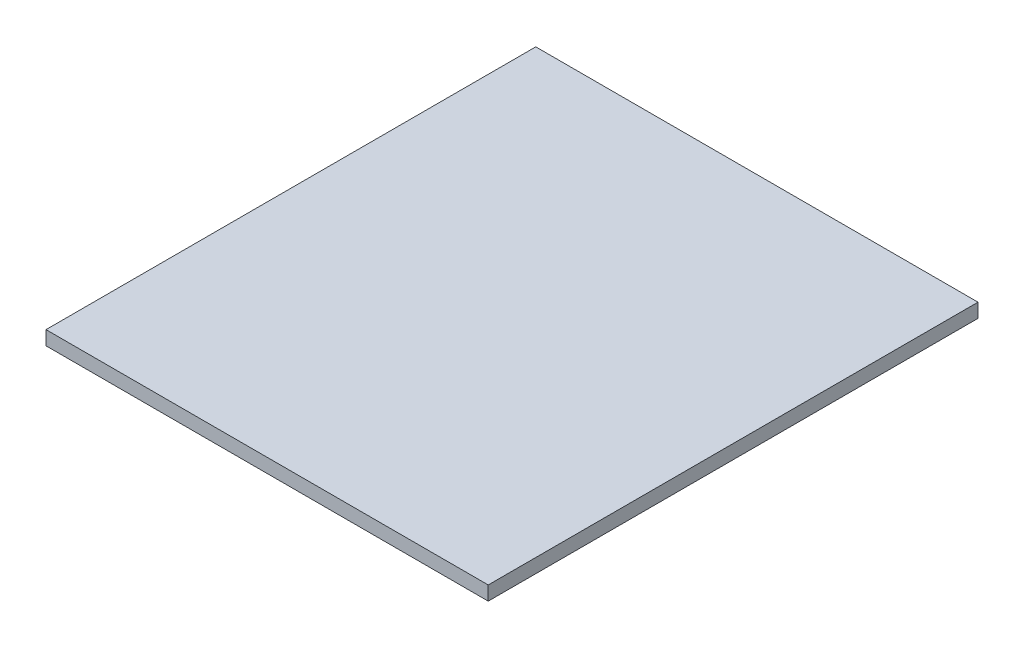
ISO-10303-21;
HEADER;
FILE_DESCRIPTION(('STEP AP214'),'2;1');
FILE_NAME('part.step','',(''),(''),'','','');
FILE_SCHEMA(('AUTOMOTIVE_DESIGN { 1 0 10303 214 1 1 1 1 }'));
ENDSEC;
DATA;
#1=APPLICATION_CONTEXT('core data for automotive mechanical design processes');
#2=APPLICATION_PROTOCOL_DEFINITION('international standard','automotive_design',2000,#1);
#3=PRODUCT_CONTEXT('',#1,'mechanical');
#4=PRODUCT('Part','Part','',(#3));
#5=PRODUCT_RELATED_PRODUCT_CATEGORY('part','',(#4));
#6=PRODUCT_DEFINITION_FORMATION('','',#4);
#7=PRODUCT_DEFINITION_CONTEXT('part definition',#1,'design');
#8=PRODUCT_DEFINITION('design','',#6,#7);
#9=PRODUCT_DEFINITION_SHAPE('','',#8);
#10=(LENGTH_UNIT() NAMED_UNIT(*) SI_UNIT(.MILLI.,.METRE.));
#11=(NAMED_UNIT(*) PLANE_ANGLE_UNIT() SI_UNIT($,.RADIAN.));
#12=(NAMED_UNIT(*) SI_UNIT($,.STERADIAN.) SOLID_ANGLE_UNIT());
#13=UNCERTAINTY_MEASURE_WITH_UNIT(LENGTH_MEASURE(1.E-05),#10,'distance_accuracy_value','');
#14=(GEOMETRIC_REPRESENTATION_CONTEXT(3) GLOBAL_UNCERTAINTY_ASSIGNED_CONTEXT((#13)) GLOBAL_UNIT_ASSIGNED_CONTEXT((#10,
#11,#12)) REPRESENTATION_CONTEXT('',''));
#15=CARTESIAN_POINT('',(0.,0.,0.));
#16=DIRECTION('',(0.,0.,1.));
#17=DIRECTION('',(1.,0.,0.));
#18=AXIS2_PLACEMENT_3D('',#15,#16,#17);
#19=CARTESIAN_POINT('',(40.,13.93,-10.16));
#20=DIRECTION('',(0.,-1.,0.));
#21=DIRECTION('',(0.,0.,-1.));
#22=AXIS2_PLACEMENT_3D('',#19,#20,#21);
#23=PLANE('',#22);
#24=DIRECTION('',(-1.,0.,0.));
#25=VECTOR('',#24,1.);
#26=CARTESIAN_POINT('',(0.,13.93,0.));
#27=LINE('',#26,#25);
#28=CARTESIAN_POINT('',(40.,13.93,0.));
#29=VERTEX_POINT('',#28);
#30=CARTESIAN_POINT('',(0.,13.93,0.));
#31=VERTEX_POINT('',#30);
#32=EDGE_CURVE('E96',#29,#31,#27,.T.);
#33=ORIENTED_EDGE('',*,*,#32,.T.);
#34=DIRECTION('',(0.,0.,-1.));
#35=VECTOR('',#34,1.);
#36=CARTESIAN_POINT('',(0.,13.93,-10.16));
#37=LINE('',#36,#35);
#38=CARTESIAN_POINT('',(0.,13.93,-44.3));
#39=VERTEX_POINT('',#38);
#40=EDGE_CURVE('E11',#31,#39,#37,.T.);
#41=ORIENTED_EDGE('',*,*,#40,.T.);
#42=DIRECTION('',(1.,0.,0.));
#43=VECTOR('',#42,1.);
#44=CARTESIAN_POINT('',(0.,13.93,-44.3));
#45=LINE('',#44,#43);
#46=CARTESIAN_POINT('',(40.,13.93,-44.3));
#47=VERTEX_POINT('',#46);
#48=EDGE_CURVE('E93',#39,#47,#45,.T.);
#49=ORIENTED_EDGE('',*,*,#48,.T.);
#50=DIRECTION('',(0.,0.,1.));
#51=VECTOR('',#50,1.);
#52=CARTESIAN_POINT('',(40.,13.93,-10.16));
#53=LINE('',#52,#51);
#54=EDGE_CURVE('E47',#47,#29,#53,.T.);
#55=ORIENTED_EDGE('',*,*,#54,.T.);
#56=EDGE_LOOP('',(#33,#41,#49,#55));
#57=FACE_BOUND('',#56,.T.);
#58=ADVANCED_FACE('F38',(#57),#23,.T.);
#59=CARTESIAN_POINT('',(0.,15.2,0.));
#60=DIRECTION('',(1.,0.,0.));
#61=DIRECTION('',(0.,0.,-1.));
#62=AXIS2_PLACEMENT_3D('',#59,#60,#61);
#63=PLANE('',#62);
#64=ORIENTED_EDGE('',*,*,#40,.F.);
#65=DIRECTION('',(0.,-1.,0.));
#66=VECTOR('',#65,1.);
#67=CARTESIAN_POINT('',(0.,15.2,0.));
#68=LINE('',#67,#66);
#69=CARTESIAN_POINT('',(0.,15.2,0.));
#70=VERTEX_POINT('',#69);
#71=EDGE_CURVE('E98',#70,#31,#68,.T.);
#72=ORIENTED_EDGE('',*,*,#71,.F.);
#73=DIRECTION('',(0.,0.,1.));
#74=VECTOR('',#73,1.);
#75=CARTESIAN_POINT('',(0.,15.2,0.));
#76=LINE('',#75,#74);
#77=CARTESIAN_POINT('',(0.,15.2,-44.3));
#78=VERTEX_POINT('',#77);
#79=EDGE_CURVE('E88',#78,#70,#76,.T.);
#80=ORIENTED_EDGE('',*,*,#79,.F.);
#81=DIRECTION('',(0.,-1.,0.));
#82=VECTOR('',#81,1.);
#83=CARTESIAN_POINT('',(0.,15.2,-44.3));
#84=LINE('',#83,#82);
#85=EDGE_CURVE('E42',#78,#39,#84,.T.);
#86=ORIENTED_EDGE('',*,*,#85,.T.);
#87=EDGE_LOOP('',(#64,#72,#80,#86));
#88=FACE_BOUND('',#87,.T.);
#89=ADVANCED_FACE('F106',(#88),#63,.F.);
#90=CARTESIAN_POINT('',(0.,15.2,0.));
#91=DIRECTION('',(0.,0.,-1.));
#92=DIRECTION('',(-1.,0.,0.));
#93=AXIS2_PLACEMENT_3D('',#90,#91,#92);
#94=PLANE('',#93);
#95=ORIENTED_EDGE('',*,*,#32,.F.);
#96=DIRECTION('',(0.,-1.,0.));
#97=VECTOR('',#96,1.);
#98=CARTESIAN_POINT('',(40.,15.2,0.));
#99=LINE('',#98,#97);
#100=CARTESIAN_POINT('',(40.,15.2,0.));
#101=VERTEX_POINT('',#100);
#102=EDGE_CURVE('E83',#101,#29,#99,.T.);
#103=ORIENTED_EDGE('',*,*,#102,.F.);
#104=DIRECTION('',(1.,0.,0.));
#105=VECTOR('',#104,1.);
#106=CARTESIAN_POINT('',(0.,15.2,0.));
#107=LINE('',#106,#105);
#108=EDGE_CURVE('E55',#70,#101,#107,.T.);
#109=ORIENTED_EDGE('',*,*,#108,.F.);
#110=ORIENTED_EDGE('',*,*,#71,.T.);
#111=EDGE_LOOP('',(#95,#103,#109,#110));
#112=FACE_BOUND('',#111,.T.);
#113=ADVANCED_FACE('F103',(#112),#94,.F.);
#114=CARTESIAN_POINT('',(40.,15.2,0.));
#115=DIRECTION('',(-1.,0.,0.));
#116=DIRECTION('',(0.,0.,1.));
#117=AXIS2_PLACEMENT_3D('',#114,#115,#116);
#118=PLANE('',#117);
#119=ORIENTED_EDGE('',*,*,#54,.F.);
#120=DIRECTION('',(0.,-1.,0.));
#121=VECTOR('',#120,1.);
#122=CARTESIAN_POINT('',(40.,15.2,-44.3));
#123=LINE('',#122,#121);
#124=CARTESIAN_POINT('',(40.,15.2,-44.3));
#125=VERTEX_POINT('',#124);
#126=EDGE_CURVE('E81',#125,#47,#123,.T.);
#127=ORIENTED_EDGE('',*,*,#126,.F.);
#128=DIRECTION('',(0.,0.,-1.));
#129=VECTOR('',#128,1.);
#130=CARTESIAN_POINT('',(40.,15.2,0.));
#131=LINE('',#130,#129);
#132=EDGE_CURVE('E107',#101,#125,#131,.T.);
#133=ORIENTED_EDGE('',*,*,#132,.F.);
#134=ORIENTED_EDGE('',*,*,#102,.T.);
#135=EDGE_LOOP('',(#119,#127,#133,#134));
#136=FACE_BOUND('',#135,.T.);
#137=ADVANCED_FACE('F79',(#136),#118,.F.);
#138=CARTESIAN_POINT('',(0.,15.2,-44.3));
#139=DIRECTION('',(0.,0.,1.));
#140=DIRECTION('',(1.,0.,0.));
#141=AXIS2_PLACEMENT_3D('',#138,#139,#140);
#142=PLANE('',#141);
#143=ORIENTED_EDGE('',*,*,#48,.F.);
#144=ORIENTED_EDGE('',*,*,#85,.F.);
#145=DIRECTION('',(-1.,0.,0.));
#146=VECTOR('',#145,1.);
#147=CARTESIAN_POINT('',(0.,15.2,-44.3));
#148=LINE('',#147,#146);
#149=EDGE_CURVE('E94',#125,#78,#148,.T.);
#150=ORIENTED_EDGE('',*,*,#149,.F.);
#151=ORIENTED_EDGE('',*,*,#126,.T.);
#152=EDGE_LOOP('',(#143,#144,#150,#151));
#153=FACE_BOUND('',#152,.T.);
#154=ADVANCED_FACE('F40',(#153),#142,.F.);
#155=CARTESIAN_POINT('',(0.,15.2,0.));
#156=DIRECTION('',(0.,-1.,0.));
#157=DIRECTION('',(0.,0.,-1.));
#158=AXIS2_PLACEMENT_3D('',#155,#156,#157);
#159=PLANE('',#158);
#160=ORIENTED_EDGE('',*,*,#79,.T.);
#161=ORIENTED_EDGE('',*,*,#108,.T.);
#162=ORIENTED_EDGE('',*,*,#132,.T.);
#163=ORIENTED_EDGE('',*,*,#149,.T.);
#164=EDGE_LOOP('',(#160,#161,#162,#163));
#165=FACE_BOUND('',#164,.T.);
#166=ADVANCED_FACE('F112',(#165),#159,.F.);
#167=CLOSED_SHELL('',(#58,#89,#113,#137,#154,#166));
#168=MANIFOLD_SOLID_BREP('B2',#167);
#169=ADVANCED_BREP_SHAPE_REPRESENTATION('',(#18,#168),#14);
#170=SHAPE_DEFINITION_REPRESENTATION(#9,#169);
ENDSEC;
END-ISO-10303-21;
